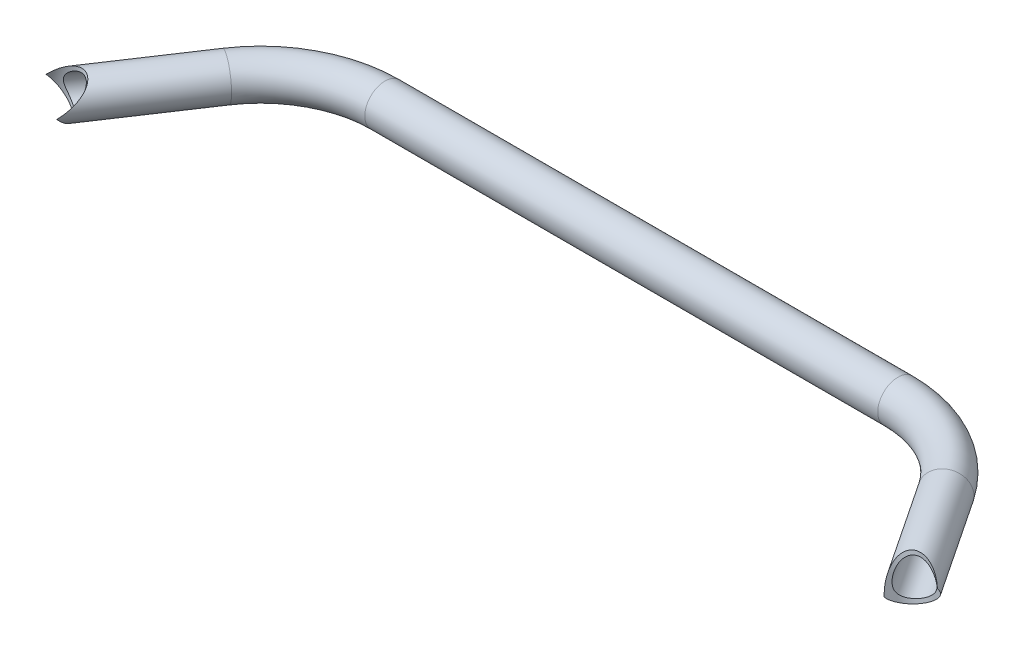
ISO-10303-21;
HEADER;
FILE_DESCRIPTION(('STEP AP214'),'2;1');
FILE_NAME('part.step','',(''),(''),'','','');
FILE_SCHEMA(('AUTOMOTIVE_DESIGN { 1 0 10303 214 1 1 1 1 }'));
ENDSEC;
DATA;
#1=APPLICATION_CONTEXT('core data for automotive mechanical design processes');
#2=APPLICATION_PROTOCOL_DEFINITION('international standard','automotive_design',2000,#1);
#3=PRODUCT_CONTEXT('',#1,'mechanical');
#4=PRODUCT('Part','Part','',(#3));
#5=PRODUCT_RELATED_PRODUCT_CATEGORY('part','',(#4));
#6=PRODUCT_DEFINITION_FORMATION('','',#4);
#7=PRODUCT_DEFINITION_CONTEXT('part definition',#1,'design');
#8=PRODUCT_DEFINITION('design','',#6,#7);
#9=PRODUCT_DEFINITION_SHAPE('','',#8);
#10=(LENGTH_UNIT() NAMED_UNIT(*) SI_UNIT(.MILLI.,.METRE.));
#11=(NAMED_UNIT(*) PLANE_ANGLE_UNIT() SI_UNIT($,.RADIAN.));
#12=(NAMED_UNIT(*) SI_UNIT($,.STERADIAN.) SOLID_ANGLE_UNIT());
#13=UNCERTAINTY_MEASURE_WITH_UNIT(LENGTH_MEASURE(1.E-05),#10,'distance_accuracy_value','');
#14=(GEOMETRIC_REPRESENTATION_CONTEXT(3) GLOBAL_UNCERTAINTY_ASSIGNED_CONTEXT((#13)) GLOBAL_UNIT_ASSIGNED_CONTEXT((#10,
#11,#12)) REPRESENTATION_CONTEXT('',''));
#15=CARTESIAN_POINT('',(0.,0.,0.));
#16=DIRECTION('',(0.,0.,1.));
#17=DIRECTION('',(1.,0.,0.));
#18=AXIS2_PLACEMENT_3D('',#15,#16,#17);
#19=CARTESIAN_POINT('',(-270.262878506434,594.406898796156,-139.7));
#20=DIRECTION('',(0.553808247981639,0.,-0.83264423643445));
#21=DIRECTION('',(-0.83264423643445,0.,-0.553808247981639));
#22=AXIS2_PLACEMENT_3D('',#19,#20,#21);
#23=CYLINDRICAL_SURFACE('',#22,10.287);
#24=CARTESIAN_POINT('',(-274.611975365629,594.406898796156,-151.736204933368));
#25=CARTESIAN_POINT('',(-274.582076108729,594.115933380823,-151.781157630946));
#26=CARTESIAN_POINT('',(-274.535729778486,593.82705969936,-151.828529056111));
#27=CARTESIAN_POINT('',(-274.41452140445,593.255256383878,-151.923589996282));
#28=CARTESIAN_POINT('',(-274.339629723799,592.972333251172,-151.9712797911));
#29=CARTESIAN_POINT('',(-274.164848563277,592.412567177773,-152.063273333682));
#30=CARTESIAN_POINT('',(-274.064861628077,592.135752628127,-152.10756298059));
#31=CARTESIAN_POINT('',(-273.843200535535,591.590058651063,-152.189334420521));
#32=CARTESIAN_POINT('',(-273.721533062038,591.32117680778,-152.226818304508));
#33=CARTESIAN_POINT('',(-273.460175463079,590.794281765628,-152.292029911035));
#34=CARTESIAN_POINT('',(-273.320664220982,590.536190527532,-152.319845458556));
#35=CARTESIAN_POINT('',(-273.024667286098,590.028903894582,-152.363993356945));
#36=CARTESIAN_POINT('',(-272.868181191144,589.779708710677,-152.380325435679));
#37=CARTESIAN_POINT('',(-272.540050506388,589.291371931625,-152.399557911396));
#38=CARTESIAN_POINT('',(-272.368423794064,589.052218958937,-152.40247393882));
#39=CARTESIAN_POINT('',(-272.011337938838,588.584782701938,-152.393207319613));
#40=CARTESIAN_POINT('',(-271.825879496993,588.356498867686,-152.38102543773));
#41=CARTESIAN_POINT('',(-271.423758280319,587.890343442846,-152.338040706149));
#42=CARTESIAN_POINT('',(-271.205818408015,587.653723214399,-152.305530678008));
#43=CARTESIAN_POINT('',(-270.756964801776,587.19727572493,-152.218782367154));
#44=CARTESIAN_POINT('',(-270.526049917994,586.977449956321,-152.164542156091));
#45=CARTESIAN_POINT('',(-270.053645059308,586.557109766013,-152.033080823247));
#46=CARTESIAN_POINT('',(-269.812161717912,586.356583476485,-151.955873945416));
#47=CARTESIAN_POINT('',(-269.321061796585,585.977233780353,-151.77769138738));
#48=CARTESIAN_POINT('',(-269.071447007386,585.798405635762,-151.676720910381));
#49=CARTESIAN_POINT('',(-268.601180660189,585.487546838889,-151.466216169023));
#50=CARTESIAN_POINT('',(-268.381192749715,585.352458681601,-151.359700945455));
#51=CARTESIAN_POINT('',(-267.939269290062,585.101797779158,-151.129176593434));
#52=CARTESIAN_POINT('',(-267.717333924666,584.986223212891,-151.005169099436));
#53=CARTESIAN_POINT('',(-267.273728988713,584.775898904107,-150.740522418265));
#54=CARTESIAN_POINT('',(-267.052059338725,584.681136194432,-150.599893671731));
#55=CARTESIAN_POINT('',(-266.610910838236,584.51327896601,-150.303138175918));
#56=CARTESIAN_POINT('',(-266.391431844381,584.440183020318,-150.147012448151));
#57=CARTESIAN_POINT('',(-265.980536039157,584.323037617388,-149.838775947939));
#58=CARTESIAN_POINT('',(-265.788686855544,584.276678295437,-149.688110809208));
#59=CARTESIAN_POINT('',(-265.409486143942,584.201703427835,-149.377022353868));
#60=CARTESIAN_POINT('',(-265.222134637329,584.173087966496,-149.216598990895));
#61=CARTESIAN_POINT('',(-264.853011818409,584.13352786896,-148.887413649381));
#62=CARTESIAN_POINT('',(-264.671240217261,584.122582316566,-148.718652103649));
#63=CARTESIAN_POINT('',(-264.314121722321,584.11808735521,-148.374246224068));
#64=CARTESIAN_POINT('',(-264.138775144053,584.124538799437,-148.198601553072));
#65=CARTESIAN_POINT('',(-263.79000669249,584.154870919684,-147.83656752283));
#66=CARTESIAN_POINT('',(-263.616800822616,584.17926928272,-147.65001389592));
#67=CARTESIAN_POINT('',(-263.278397174178,584.245513870208,-147.272811000581));
#68=CARTESIAN_POINT('',(-263.113199478211,584.287360274574,-147.08216168994));
#69=CARTESIAN_POINT('',(-262.79102854104,584.387892203045,-146.698288782445));
#70=CARTESIAN_POINT('',(-262.634057781012,584.446582773043,-146.505064430767));
#71=CARTESIAN_POINT('',(-262.328445844146,584.580172961135,-146.117625425795));
#72=CARTESIAN_POINT('',(-262.179805577921,584.655074346914,-145.923410666759));
#73=CARTESIAN_POINT('',(-261.871526607006,584.83149752742,-145.509721181256));
#74=CARTESIAN_POINT('',(-261.7130531326,584.93523460652,-145.290321164587));
#75=CARTESIAN_POINT('',(-261.406235243498,585.162023742278,-144.854418380354));
#76=CARTESIAN_POINT('',(-261.257892172906,585.285078354873,-144.637916000301));
#77=CARTESIAN_POINT('',(-260.970549790214,585.550046218087,-144.209965488957));
#78=CARTESIAN_POINT('',(-260.831559038787,585.691976402175,-143.998522099495));
#79=CARTESIAN_POINT('',(-260.562170633412,585.994231633129,-143.583483479216));
#80=CARTESIAN_POINT('',(-260.431771814367,586.154554177811,-143.379887185866));
#81=CARTESIAN_POINT('',(-260.194834248731,586.471458283465,-143.009232176519));
#82=CARTESIAN_POINT('',(-260.087393958123,586.625829887968,-142.840858678921));
#83=CARTESIAN_POINT('',(-259.877217557075,586.948396484922,-142.514665430573));
#84=CARTESIAN_POINT('',(-259.774481754267,587.116592379358,-142.356846369681));
#85=CARTESIAN_POINT('',(-259.572877853876,587.466470015348,-142.054905185034));
#86=CARTESIAN_POINT('',(-259.474003462614,587.648128282995,-141.910760174657));
#87=CARTESIAN_POINT('',(-259.278870717423,588.02495883924,-141.639342190141));
#88=CARTESIAN_POINT('',(-259.182611355638,588.220125815546,-141.512062640413));
#89=CARTESIAN_POINT('',(-259.017487292259,588.568781435159,-141.309954046311));
#90=CARTESIAN_POINT('',(-258.948252212227,588.719272570624,-141.230247928182));
#91=CARTESIAN_POINT('',(-258.810297223909,589.026550515003,-141.083581152011));
#92=CARTESIAN_POINT('',(-258.741577165877,589.18333540243,-141.016616639248));
#93=CARTESIAN_POINT('',(-258.604545552731,589.502144440168,-140.897077132109));
#94=CARTESIAN_POINT('',(-258.53623350067,589.664159194454,-140.844477780359));
#95=CARTESIAN_POINT('',(-258.399860653449,589.992549872062,-140.754794497396));
#96=CARTESIAN_POINT('',(-258.33179985446,590.158925728646,-140.717710328897));
#97=CARTESIAN_POINT('',(-258.195822224413,590.495296350005,-140.659724288));
#98=CARTESIAN_POINT('',(-258.127906931458,590.665302493397,-140.638884648432));
#99=CARTESIAN_POINT('',(-257.992814062861,591.006811338237,-140.613747037851));
#100=CARTESIAN_POINT('',(-257.925636483974,591.178314033095,-140.609448994043));
#101=CARTESIAN_POINT('',(-257.79240098636,591.52158920729,-140.616848057836));
#102=CARTESIAN_POINT('',(-257.726344286728,591.693361782915,-140.628561575972));
#103=CARTESIAN_POINT('',(-257.595889242748,592.035941974095,-140.666925799881));
#104=CARTESIAN_POINT('',(-257.531491936133,592.206748936056,-140.693585626339));
#105=CARTESIAN_POINT('',(-257.381898752813,592.608162317545,-140.772574343849));
#106=CARTESIAN_POINT('',(-257.297635408227,592.837976684038,-140.83070739835));
#107=CARTESIAN_POINT('',(-257.134299884718,593.292930698897,-140.968222900946));
#108=CARTESIAN_POINT('',(-257.055228247841,593.51806985747,-141.047607563459));
#109=CARTESIAN_POINT('',(-256.902938761752,593.964118911411,-141.22430468573));
#110=CARTESIAN_POINT('',(-256.829741174738,594.185012323472,-141.321675670897));
#111=CARTESIAN_POINT('',(-256.690281220004,594.62189942529,-141.531090588348));
#112=CARTESIAN_POINT('',(-256.624018762139,594.837893178708,-141.643134329866));
#113=CARTESIAN_POINT('',(-256.461041709912,595.395626853542,-141.951391911024));
#114=CARTESIAN_POINT('',(-256.370371199602,595.733800091885,-142.157295926447));
#115=CARTESIAN_POINT('',(-256.211427648958,596.400006325126,-142.592960509066));
#116=CARTESIAN_POINT('',(-256.143168500043,596.728032917091,-142.82273575686));
#117=CARTESIAN_POINT('',(-256.031882409486,597.374779618118,-143.300714080033));
#118=CARTESIAN_POINT('',(-255.988854136236,597.693500217479,-143.548916182121));
#119=CARTESIAN_POINT('',(-255.93113717954,598.321770158966,-144.059613845064));
#120=CARTESIAN_POINT('',(-255.916435885819,598.631323521597,-144.322102992243));
#121=CARTESIAN_POINT('',(-255.918607689646,599.174576381071,-144.799860055523));
#122=CARTESIAN_POINT('',(-255.929323085845,599.410163489604,-145.013019053361));
#123=CARTESIAN_POINT('',(-255.972188229145,599.874671955724,-145.444482894816));
#124=CARTESIAN_POINT('',(-256.004338593134,600.103593121271,-145.662787886356));
#125=CARTESIAN_POINT('',(-256.09204532553,600.553102218587,-146.102326197866));
#126=CARTESIAN_POINT('',(-256.147551164855,600.773707026584,-146.32355220336));
#127=CARTESIAN_POINT('',(-256.284137354081,601.20550727123,-146.767468922239));
#128=CARTESIAN_POINT('',(-256.365219236206,601.416702143279,-146.990159722595));
#129=CARTESIAN_POINT('',(-256.530739325767,601.774858058883,-147.377674852376));
#130=CARTESIAN_POINT('',(-256.609012960576,601.924430336974,-147.542729277797));
#131=CARTESIAN_POINT('',(-256.781625817116,602.215990888271,-147.871101643019));
#132=CARTESIAN_POINT('',(-256.875960858978,602.357981122053,-148.034420022895));
#133=CARTESIAN_POINT('',(-257.081275689819,602.633105087115,-148.357966988319));
#134=CARTESIAN_POINT('',(-257.192250458152,602.766241472405,-148.518196489462));
#135=CARTESIAN_POINT('',(-257.431197838064,603.022320264297,-148.834118244295));
#136=CARTESIAN_POINT('',(-257.55917065215,603.145262549423,-148.989810443903));
#137=CARTESIAN_POINT('',(-257.833312324253,603.380568936413,-149.29641510338));
#138=CARTESIAN_POINT('',(-257.979636222049,603.492826552981,-149.447271149215));
#139=CARTESIAN_POINT('',(-258.289018233597,603.704031178803,-149.740969444043));
#140=CARTESIAN_POINT('',(-258.452076282448,603.802978239678,-149.883811724114));
#141=CARTESIAN_POINT('',(-258.793744395931,603.986213531596,-150.159722520711));
#142=CARTESIAN_POINT('',(-258.972344053195,604.070511460709,-150.292797469471));
#143=CARTESIAN_POINT('',(-259.343603119581,604.223527218801,-150.547803738469));
#144=CARTESIAN_POINT('',(-259.536260961026,604.292246781478,-150.669736297829));
#145=CARTESIAN_POINT('',(-259.90686462927,604.405338682094,-150.885723246821));
#146=CARTESIAN_POINT('',(-260.083299088081,604.451743340734,-150.981320807589));
#147=CARTESIAN_POINT('',(-260.443836172604,604.53232604734,-151.162878285257));
#148=CARTESIAN_POINT('',(-260.627941589939,604.56649959999,-151.248834650761));
#149=CARTESIAN_POINT('',(-261.002266095418,604.622680630135,-151.41081068781));
#150=CARTESIAN_POINT('',(-261.192485318392,604.64468783913,-151.486830140028));
#151=CARTESIAN_POINT('',(-261.577597995387,604.676824757415,-151.628918426293));
#152=CARTESIAN_POINT('',(-261.772492390269,604.686952055101,-151.694985237598));
#153=CARTESIAN_POINT('',(-262.217553366296,604.696908836119,-151.833497178495));
#154=CARTESIAN_POINT('',(-262.468716286433,604.693309874317,-151.903014318819));
#155=CARTESIAN_POINT('',(-262.973818301604,604.66888861983,-152.027079298025));
#156=CARTESIAN_POINT('',(-263.227758010626,604.648062438741,-152.081623753678));
#157=CARTESIAN_POINT('',(-263.991281712282,604.561437727661,-152.224317749179));
#158=CARTESIAN_POINT('',(-264.502302677001,604.471489534751,-152.291447859001));
#159=CARTESIAN_POINT('',(-265.357559280804,604.273050151264,-152.365083426165));
#160=CARTESIAN_POINT('',(-265.704415243869,604.178938436015,-152.383928026837));
#161=CARTESIAN_POINT('',(-266.39148151337,603.966871048511,-152.402402484021));
#162=CARTESIAN_POINT('',(-266.731689057246,603.84890568625,-152.402024516116));
#163=CARTESIAN_POINT('',(-267.403948892215,603.590726407942,-152.385031587123));
#164=CARTESIAN_POINT('',(-267.735980263743,603.450461135349,-152.368378677793));
#165=CARTESIAN_POINT('',(-268.389396456275,603.149104222519,-152.321786069872));
#166=CARTESIAN_POINT('',(-268.710782863501,602.988015702883,-152.291848360528));
#167=CARTESIAN_POINT('',(-269.352209992212,602.639632146513,-152.220489280254));
#168=CARTESIAN_POINT('',(-269.671824333149,602.4516263776,-152.17870838961));
#169=CARTESIAN_POINT('',(-270.296097880479,602.053584432275,-152.087672035072));
#170=CARTESIAN_POINT('',(-270.600751897807,601.843540690016,-152.038414001593));
#171=CARTESIAN_POINT('',(-271.191514295365,601.400958996423,-151.936586059321));
#172=CARTESIAN_POINT('',(-271.477667105941,601.168478552365,-151.884024731878));
#173=CARTESIAN_POINT('',(-272.028146496136,600.678778275252,-151.780319833048));
#174=CARTESIAN_POINT('',(-272.292491249721,600.421579436584,-151.729175105226));
#175=CARTESIAN_POINT('',(-272.678295987201,600.004411558751,-151.656105137929));
#176=CARTESIAN_POINT('',(-272.809642938843,599.854007525459,-151.63154421525));
#177=CARTESIAN_POINT('',(-273.062884524206,599.544873666561,-151.585712290947));
#178=CARTESIAN_POINT('',(-273.184777905875,599.386142742775,-151.564441724734));
#179=CARTESIAN_POINT('',(-273.417328140583,599.060455125178,-151.526401569833));
#180=CARTESIAN_POINT('',(-273.528001434113,598.893511015111,-151.509625334693));
#181=CARTESIAN_POINT('',(-273.736461442334,598.551380736019,-151.481707144114));
#182=CARTESIAN_POINT('',(-273.834254879273,598.376198931718,-151.470562240888));
#183=CARTESIAN_POINT('',(-274.016397432141,598.015562356852,-151.454797993114));
#184=CARTESIAN_POINT('',(-274.100539720539,597.829998286555,-151.450271953932));
#185=CARTESIAN_POINT('',(-274.251895494595,597.452032488914,-151.448733875008));
#186=CARTESIAN_POINT('',(-274.319109528682,597.259630983314,-151.451721591807));
#187=CARTESIAN_POINT('',(-274.435270060266,596.869782434538,-151.465334553514));
#188=CARTESIAN_POINT('',(-274.484228948887,596.672338911375,-151.475954603403));
#189=CARTESIAN_POINT('',(-274.563405589457,596.274301285369,-151.504295935993));
#190=CARTESIAN_POINT('',(-274.593627102421,596.073707823082,-151.522015792425));
#191=CARTESIAN_POINT('',(-274.640108603166,595.628220752844,-151.56790656973));
#192=CARTESIAN_POINT('',(-274.652007900813,595.383016168041,-151.597501333023));
#193=CARTESIAN_POINT('',(-274.650407745834,594.893689096076,-151.662905450747));
#194=CARTESIAN_POINT('',(-274.636911604778,594.649566471989,-151.698713994347));
#195=CARTESIAN_POINT('',(-274.611975365629,594.406898796156,-151.736204933368));
#196=B_SPLINE_CURVE_WITH_KNOTS('',3,(#24,#25,#26,#27,#28,#29,#30,#31,#32,#33,#34,#35,#36,#37,
#38,#39,#40,#41,#42,#43,#44,#45,#46,#47,#48,#49,#50,#51,#52,#53,#54,#55,#56,#57,#58,#59,#60,#61,
#62,#63,#64,#65,#66,#67,#68,#69,#70,#71,#72,#73,#74,#75,#76,#77,#78,#79,#80,#81,#82,#83,#84,#85,
#86,#87,#88,#89,#90,#91,#92,#93,#94,#95,#96,#97,#98,#99,#100,#101,#102,#103,#104,#105,#106,#107,
#108,#109,#110,#111,#112,#113,#114,#115,#116,#117,#118,#119,#120,#121,#122,#123,#124,#125,#126,
#127,#128,#129,#130,#131,#132,#133,#134,#135,#136,#137,#138,#139,#140,#141,#142,#143,#144,#145,
#146,#147,#148,#149,#150,#151,#152,#153,#154,#155,#156,#157,#158,#159,#160,#161,#162,#163,#164,
#165,#166,#167,#168,#169,#170,#171,#172,#173,#174,#175,#176,#177,#178,#179,#180,#181,#182,#183,
#184,#185,#186,#187,#188,#189,#190,#191,#192,#193,#194,#195),.UNSPECIFIED.,.T.,.F.,(4,2,2,2,2,2,
2,2,2,2,2,2,2,2,2,2,2,2,2,2,2,2,2,2,2,2,2,2,2,2,2,2,2,2,2,2,2,2,2,2,2,2,2,2,2,2,2,2,2,2,2,2,2,2,
2,2,2,2,2,2,2,2,2,2,2,2,2,2,2,2,2,2,2,2,2,2,2,2,2,2,2,2,2,2,2,4),(0.,0.887423883337758,
1.77577164442881,2.66762410314902,3.55920208880639,4.44245545707858,5.32572975584576,
6.20797473021,7.09017501849149,8.05879389419339,9.02749874480351,9.99560405189722,
10.9634975825277,11.8001121543026,12.6366486056134,13.4726623516033,14.308621026672,
15.0526750421743,15.796732593113,16.5407515628895,17.2848070217543,18.0512110549819,
18.8176229910729,19.5842647560439,20.350990160481,21.2196557809287,22.0884364331144,
22.9580018021537,23.827449011404,24.5841702361956,25.3409408734744,26.0964216696178,
26.8516070430467,27.4026202194882,27.9534664317674,28.5033727544261,29.0532706666372,
29.6052650246151,30.1572569533421,30.7098150527805,31.2627107073368,32.0162402397385,
32.769848320524,33.5259531889715,34.2820482279956,35.4988149249905,36.7163344029179,
37.9337896180972,39.1507027354166,40.1036264798242,41.0565776501254,42.0074776458317,
42.9584346194231,43.6661253057949,44.3736321013774,45.0809258514302,45.7882280286051,
46.5019690274583,47.2157072582388,47.9289711622977,48.6421556490218,49.2593226209853,
49.8767161889105,50.4941233816434,51.1116558854698,51.8923744357708,52.6732692523884,
54.2358864732946,55.3143631555046,56.3932788278954,57.47471622215,58.5559917381358,
59.674452673182,60.79329885087,61.9093498624937,63.024461203513,63.6276836478692,
64.2309858483774,64.8333908662866,65.4354802206961,66.045977968496,66.6564559353363,
67.2665187677895,67.8764591071538,68.6166748275501,69.3567940303821),.UNSPECIFIED.);
#197=CARTESIAN_POINT('',(-274.611975365629,594.406898796156,-151.736204933368));
#198=VERTEX_POINT('',#197);
#199=EDGE_CURVE('E49',#198,#198,#196,.T.);
#200=ORIENTED_EDGE('',*,*,#199,.T.);
#201=EDGE_LOOP('',(#200));
#202=FACE_BOUND('',#201,.T.);
#203=CARTESIAN_POINT('',(-226.416989788848,594.406898796156,-205.621781889487));
#204=DIRECTION('',(-0.553808247981638,0.,0.83264423643445));
#205=DIRECTION('',(0.83264423643445,0.,0.553808247981638));
#206=AXIS2_PLACEMENT_3D('',#203,#204,#205);
#207=CIRCLE('',#206,10.287);
#208=CARTESIAN_POINT('',(-234.982401049049,594.406898796156,-211.318807336474));
#209=VERTEX_POINT('',#208);
#210=EDGE_CURVE('E112',#209,#209,#207,.F.);
#211=ORIENTED_EDGE('',*,*,#210,.T.);
#212=EDGE_LOOP('',(#211));
#213=FACE_BOUND('',#212,.T.);
#214=ADVANCED_FACE('F45',(#202,#213),#23,.F.);
#215=CARTESIAN_POINT('',(-270.262878506434,594.406898796156,-139.7));
#216=DIRECTION('',(0.553808247981639,0.,-0.83264423643445));
#217=DIRECTION('',(-0.83264423643445,0.,-0.553808247981639));
#218=AXIS2_PLACEMENT_3D('',#215,#216,#217);
#219=CYLINDRICAL_SURFACE('',#218,12.7);
#220=CARTESIAN_POINT('',(-270.262878506435,594.406898796156,-139.7));
#221=DIRECTION('',(0.150809635886844,-0.737110127393131,-0.65872992479328));
#222=DIRECTION('',(0.591635718191291,0.601137495126815,-0.537215868076264));
#223=AXIS2_PLACEMENT_3D('',#220,#221,#222);
#224=ELLIPSE('',#223,20.0947047461687,12.7);
#225=CARTESIAN_POINT('',(-260.20480217977,590.486271347968,-133.010173319173));
#226=VERTEX_POINT('',#225);
#227=CARTESIAN_POINT('',(-280.320954833099,598.327526244344,-146.389826680827));
#228=VERTEX_POINT('',#227);
#229=EDGE_CURVE('E68',#226,#228,#224,.F.);
#230=ORIENTED_EDGE('',*,*,#229,.F.);
#231=CARTESIAN_POINT('',(-270.262878506435,594.406898796156,-139.7));
#232=DIRECTION('',(0.591635718191291,0.601137495126815,-0.537215868076264));
#233=DIRECTION('',(0.150809635886844,-0.737110127393131,-0.65872992479328));
#234=AXIS2_PLACEMENT_3D('',#231,#232,#233);
#235=ELLIPSE('',#234,16.3878910728656,12.7);
#236=EDGE_CURVE('E59',#228,#226,#235,.F.);
#237=ORIENTED_EDGE('',*,*,#236,.F.);
#238=EDGE_LOOP('',(#230,#237));
#239=FACE_BOUND('',#238,.T.);
#240=CARTESIAN_POINT('',(-226.416989788848,594.406898796156,-205.621781889487));
#241=DIRECTION('',(0.553808247981639,0.,-0.83264423643445));
#242=DIRECTION('',(-0.83264423643445,0.,-0.553808247981639));
#243=AXIS2_PLACEMENT_3D('',#240,#241,#242);
#244=CIRCLE('',#243,12.7);
#245=CARTESIAN_POINT('',(-236.991571591565,594.406898796156,-212.655146638854));
#246=VERTEX_POINT('',#245);
#247=EDGE_CURVE('E11',#246,#246,#244,.T.);
#248=ORIENTED_EDGE('',*,*,#247,.F.);
#249=EDGE_LOOP('',(#248));
#250=FACE_BOUND('',#249,.T.);
#251=ADVANCED_FACE('F47',(#239,#250),#219,.T.);
#252=CARTESIAN_POINT('',(-76.9133172812,1090.43072922398,-139.7));
#253=DIRECTION('',(-0.363182667764731,-0.931717956162321,0.));
#254=DIRECTION('',(0.931717956162321,-0.363182667764731,0.));
#255=AXIS2_PLACEMENT_3D('',#252,#253,#254);
#256=CYLINDRICAL_SURFACE('',#255,12.7);
#257=ORIENTED_EDGE('',*,*,#199,.F.);
#258=EDGE_LOOP('',(#257));
#259=FACE_BOUND('',#258,.T.);
#260=ORIENTED_EDGE('',*,*,#229,.T.);
#261=ORIENTED_EDGE('',*,*,#236,.T.);
#262=EDGE_LOOP('',(#260,#261));
#263=FACE_BOUND('',#262,.T.);
#264=ADVANCED_FACE('F150',(#259,#263),#256,.F.);
#265=CARTESIAN_POINT('',(-161.277565884108,594.406898796156,-162.296255033388));
#266=DIRECTION('',(0.,-1.,0.));
#267=DIRECTION('',(0.,0.,-1.));
#268=AXIS2_PLACEMENT_3D('',#265,#266,#267);
#269=TOROIDAL_SURFACE('',#268,78.232,10.287);
#270=CARTESIAN_POINT('',(-161.277565884108,594.406898796156,-240.528255033388));
#271=DIRECTION('',(1.,0.,0.));
#272=DIRECTION('',(0.,0.,-1.));
#273=AXIS2_PLACEMENT_3D('',#270,#271,#272);
#274=CIRCLE('',#273,10.287);
#275=CARTESIAN_POINT('',(-161.277565884108,594.406898796156,-250.815255033388));
#276=VERTEX_POINT('',#275);
#277=EDGE_CURVE('E117',#276,#276,#274,.F.);
#278=CARTESIAN_POINT('',(-161.277565884108,594.406898796156,-162.296255033388));
#279=DIRECTION('',(0.,-1.,0.));
#280=DIRECTION('',(0.,0.,-1.));
#281=AXIS2_PLACEMENT_3D('',#278,#279,#280);
#282=CIRCLE('',#281,88.519);
#283=EDGE_CURVE('',#209,#276,#282,.T.);
#284=ORIENTED_EDGE('',*,*,#210,.F.);
#285=ORIENTED_EDGE('',*,*,#277,.F.);
#286=ORIENTED_EDGE('',*,*,#283,.T.);
#287=ORIENTED_EDGE('',*,*,#283,.F.);
#288=EDGE_LOOP('',(#284,#286,#285,#287));
#289=FACE_BOUND('',#288,.T.);
#290=ADVANCED_FACE('F157',(#289),#269,.F.);
#291=CARTESIAN_POINT('',(-161.277565884108,594.406898796156,-162.296255033388));
#292=DIRECTION('',(0.,-1.,0.));
#293=DIRECTION('',(0.,0.,-1.));
#294=AXIS2_PLACEMENT_3D('',#291,#292,#293);
#295=TOROIDAL_SURFACE('',#294,78.232,12.7);
#296=CARTESIAN_POINT('',(-161.277565884108,594.406898796156,-240.528255033388));
#297=DIRECTION('',(1.,0.,0.));
#298=DIRECTION('',(0.,0.,-1.));
#299=AXIS2_PLACEMENT_3D('',#296,#297,#298);
#300=CIRCLE('',#299,12.7);
#301=CARTESIAN_POINT('',(-161.277565884108,594.406898796156,-253.228255033388));
#302=VERTEX_POINT('',#301);
#303=EDGE_CURVE('E113',#302,#302,#300,.T.);
#304=CARTESIAN_POINT('',(-161.277565884108,594.406898796156,-162.296255033388));
#305=DIRECTION('',(0.,-1.,0.));
#306=DIRECTION('',(0.,0.,-1.));
#307=AXIS2_PLACEMENT_3D('',#304,#305,#306);
#308=CIRCLE('',#307,90.932);
#309=EDGE_CURVE('',#246,#302,#308,.T.);
#310=ORIENTED_EDGE('',*,*,#247,.T.);
#311=ORIENTED_EDGE('',*,*,#303,.F.);
#312=ORIENTED_EDGE('',*,*,#309,.T.);
#313=ORIENTED_EDGE('',*,*,#309,.F.);
#314=EDGE_LOOP('',(#310,#312,#311,#313));
#315=FACE_BOUND('',#314,.T.);
#316=ADVANCED_FACE('F159',(#315),#295,.T.);
#317=CARTESIAN_POINT('',(-161.277565884108,594.406898796156,-240.528255033388));
#318=DIRECTION('',(1.,0.,0.));
#319=DIRECTION('',(0.,0.,-1.));
#320=AXIS2_PLACEMENT_3D('',#317,#318,#319);
#321=CYLINDRICAL_SURFACE('',#320,10.287);
#322=ORIENTED_EDGE('',*,*,#277,.T.);
#323=EDGE_LOOP('',(#322));
#324=FACE_BOUND('',#323,.T.);
#325=CARTESIAN_POINT('',(161.277565884108,594.406898796156,-240.528255033388));
#326=DIRECTION('',(-1.,0.,0.));
#327=DIRECTION('',(0.,-1.,0.));
#328=AXIS2_PLACEMENT_3D('',#325,#326,#327);
#329=CIRCLE('',#328,10.287);
#330=CARTESIAN_POINT('',(161.277565884108,594.406898796156,-250.815255033388));
#331=VERTEX_POINT('',#330);
#332=EDGE_CURVE('E87',#331,#331,#329,.F.);
#333=ORIENTED_EDGE('',*,*,#332,.T.);
#334=EDGE_LOOP('',(#333));
#335=FACE_BOUND('',#334,.T.);
#336=ADVANCED_FACE('F162',(#324,#335),#321,.F.);
#337=CARTESIAN_POINT('',(-161.277565884108,594.406898796156,-240.528255033388));
#338=DIRECTION('',(1.,0.,0.));
#339=DIRECTION('',(0.,0.,-1.));
#340=AXIS2_PLACEMENT_3D('',#337,#338,#339);
#341=CYLINDRICAL_SURFACE('',#340,12.7);
#342=ORIENTED_EDGE('',*,*,#303,.T.);
#343=EDGE_LOOP('',(#342));
#344=FACE_BOUND('',#343,.T.);
#345=CARTESIAN_POINT('',(161.277565884108,594.406898796156,-240.528255033388));
#346=DIRECTION('',(1.,0.,0.));
#347=DIRECTION('',(0.,0.,-1.));
#348=AXIS2_PLACEMENT_3D('',#345,#346,#347);
#349=CIRCLE('',#348,12.7);
#350=CARTESIAN_POINT('',(161.277565884108,594.406898796156,-253.228255033388));
#351=VERTEX_POINT('',#350);
#352=EDGE_CURVE('E108',#351,#351,#349,.T.);
#353=ORIENTED_EDGE('',*,*,#352,.F.);
#354=EDGE_LOOP('',(#353));
#355=FACE_BOUND('',#354,.T.);
#356=ADVANCED_FACE('F167',(#344,#355),#341,.T.);
#357=CARTESIAN_POINT('',(161.277565884108,594.406898796156,-162.296255033388));
#358=DIRECTION('',(0.,-1.,0.));
#359=DIRECTION('',(0.,0.,-1.));
#360=AXIS2_PLACEMENT_3D('',#357,#358,#359);
#361=TOROIDAL_SURFACE('',#360,78.232,10.287);
#362=CARTESIAN_POINT('',(226.416989788848,594.406898796156,-205.621781889487));
#363=DIRECTION('',(0.553808247981637,0.,0.832644236434451));
#364=DIRECTION('',(0.832644236434451,0.,-0.553808247981637));
#365=AXIS2_PLACEMENT_3D('',#362,#363,#364);
#366=CIRCLE('',#365,10.287);
#367=CARTESIAN_POINT('',(234.982401049049,594.406898796156,-211.318807336474));
#368=VERTEX_POINT('',#367);
#369=EDGE_CURVE('E103',#368,#368,#366,.F.);
#370=CARTESIAN_POINT('',(161.277565884108,594.406898796156,-162.296255033388));
#371=DIRECTION('',(0.,-1.,0.));
#372=DIRECTION('',(0.,0.,-1.));
#373=AXIS2_PLACEMENT_3D('',#370,#371,#372);
#374=CIRCLE('',#373,88.519);
#375=EDGE_CURVE('',#331,#368,#374,.T.);
#376=ORIENTED_EDGE('',*,*,#332,.F.);
#377=ORIENTED_EDGE('',*,*,#369,.F.);
#378=ORIENTED_EDGE('',*,*,#375,.T.);
#379=ORIENTED_EDGE('',*,*,#375,.F.);
#380=EDGE_LOOP('',(#376,#378,#377,#379));
#381=FACE_BOUND('',#380,.T.);
#382=ADVANCED_FACE('F170',(#381),#361,.F.);
#383=CARTESIAN_POINT('',(161.277565884108,594.406898796156,-162.296255033388));
#384=DIRECTION('',(0.,-1.,0.));
#385=DIRECTION('',(0.,0.,-1.));
#386=AXIS2_PLACEMENT_3D('',#383,#384,#385);
#387=TOROIDAL_SURFACE('',#386,78.232,12.7);
#388=CARTESIAN_POINT('',(226.416989788848,594.406898796156,-205.621781889487));
#389=DIRECTION('',(0.553808247981637,0.,0.832644236434451));
#390=DIRECTION('',(0.832644236434451,0.,-0.553808247981637));
#391=AXIS2_PLACEMENT_3D('',#388,#389,#390);
#392=CIRCLE('',#391,12.7);
#393=CARTESIAN_POINT('',(236.991571591565,594.406898796156,-212.655146638854));
#394=VERTEX_POINT('',#393);
#395=EDGE_CURVE('E92',#394,#394,#392,.T.);
#396=CARTESIAN_POINT('',(161.277565884108,594.406898796156,-162.296255033388));
#397=DIRECTION('',(0.,-1.,0.));
#398=DIRECTION('',(0.,0.,-1.));
#399=AXIS2_PLACEMENT_3D('',#396,#397,#398);
#400=CIRCLE('',#399,90.932);
#401=EDGE_CURVE('',#351,#394,#400,.T.);
#402=ORIENTED_EDGE('',*,*,#352,.T.);
#403=ORIENTED_EDGE('',*,*,#395,.F.);
#404=ORIENTED_EDGE('',*,*,#401,.T.);
#405=ORIENTED_EDGE('',*,*,#401,.F.);
#406=EDGE_LOOP('',(#402,#404,#403,#405));
#407=FACE_BOUND('',#406,.T.);
#408=ADVANCED_FACE('F175',(#407),#387,.T.);
#409=CARTESIAN_POINT('',(226.416989788848,594.406898796156,-205.621781889487));
#410=DIRECTION('',(0.553808247981637,0.,0.832644236434451));
#411=DIRECTION('',(0.832644236434451,0.,-0.553808247981637));
#412=AXIS2_PLACEMENT_3D('',#409,#410,#411);
#413=CYLINDRICAL_SURFACE('',#412,10.287);
#414=CARTESIAN_POINT('',(274.611975365629,594.406898796156,-151.736204933368));
#415=CARTESIAN_POINT('',(274.631537092773,594.597246703728,-151.706798477842));
#416=CARTESIAN_POINT('',(274.644055562792,594.788453974988,-151.678430374484));
#417=CARTESIAN_POINT('',(274.653801105204,595.1717062049,-151.625149823471));
#418=CARTESIAN_POINT('',(274.651035277454,595.363750733209,-151.600235776852));
#419=CARTESIAN_POINT('',(274.629227286598,595.74720611606,-151.555218065277));
#420=CARTESIAN_POINT('',(274.610210292006,595.938617491249,-151.5351070234));
#421=CARTESIAN_POINT('',(274.555350501468,596.319562080426,-151.500779177323));
#422=CARTESIAN_POINT('',(274.519508729488,596.509095407997,-151.486562014517));
#423=CARTESIAN_POINT('',(274.430853480966,596.885321876315,-151.464735985225));
#424=CARTESIAN_POINT('',(274.377974894085,597.072001195524,-151.457152892349));
#425=CARTESIAN_POINT('',(274.255998484467,597.440127681862,-151.448943869082));
#426=CARTESIAN_POINT('',(274.186900346335,597.621574747171,-151.448318073989));
#427=CARTESIAN_POINT('',(274.03365898224,597.978176890035,-151.453755504433));
#428=CARTESIAN_POINT('',(273.949494034547,598.153322438999,-151.459828453638));
#429=CARTESIAN_POINT('',(273.767791386426,598.496232224488,-151.477979402722));
#430=CARTESIAN_POINT('',(273.670248865791,598.663993771498,-151.490059571261));
#431=CARTESIAN_POINT('',(273.428709261149,599.046839848229,-151.524185658539));
#432=CARTESIAN_POINT('',(273.280125129148,599.25885270311,-151.548217183106));
#433=CARTESIAN_POINT('',(272.9658703376,599.668888728113,-151.602752229931));
#434=CARTESIAN_POINT('',(272.80019241122,599.866905887672,-151.633258510582));
#435=CARTESIAN_POINT('',(272.454294413381,600.250114862255,-151.698378851999));
#436=CARTESIAN_POINT('',(272.274031362528,600.435265544599,-151.733005206132));
#437=CARTESIAN_POINT('',(271.901761377455,600.79287084257,-151.804106910902));
#438=CARTESIAN_POINT('',(271.709754638938,600.965325669661,-151.840582230724));
#439=CARTESIAN_POINT('',(271.201167325407,601.395201318739,-151.934690648184));
#440=CARTESIAN_POINT('',(270.877049720537,601.643742459419,-151.992298086469));
#441=CARTESIAN_POINT('',(270.208442781054,602.113464893377,-152.10128270755));
#442=CARTESIAN_POINT('',(269.863941548546,602.334629969726,-152.152656197154));
#443=CARTESIAN_POINT('',(269.157998959446,602.750312024855,-152.244054557592));
#444=CARTESIAN_POINT('',(268.796565772737,602.944841681389,-152.284084837267));
#445=CARTESIAN_POINT('',(268.059226242358,603.306983947666,-152.348229147371));
#446=CARTESIAN_POINT('',(267.683327052214,603.47460965481,-152.372350940273));
#447=CARTESIAN_POINT('',(267.016488724748,603.742501003079,-152.396709200635));
#448=CARTESIAN_POINT('',(266.72823136357,603.849059861478,-152.401457408796));
#449=CARTESIAN_POINT('',(266.146073551126,604.045380328347,-152.397761176948));
#450=CARTESIAN_POINT('',(265.852173085823,604.135141895031,-152.389316704119));
#451=CARTESIAN_POINT('',(265.260713966373,604.296358375234,-152.357337673638));
#452=CARTESIAN_POINT('',(264.963162638319,604.367845143342,-152.333829627514));
#453=CARTESIAN_POINT('',(264.365824943218,604.491044009406,-152.269813501835));
#454=CARTESIAN_POINT('',(264.06603949253,604.542763804097,-152.229312051973));
#455=CARTESIAN_POINT('',(263.538479762116,604.614775688242,-152.141419190706));
#456=CARTESIAN_POINT('',(263.310660084815,604.639628564381,-152.098003121336));
#457=CARTESIAN_POINT('',(262.856564690984,604.675965289565,-151.999546168317));
#458=CARTESIAN_POINT('',(262.630288167415,604.687456761266,-151.944511934007));
#459=CARTESIAN_POINT('',(262.180800516386,604.696259970931,-151.82220206577));
#460=CARTESIAN_POINT('',(261.957588848892,604.693574239947,-151.754928618975));
#461=CARTESIAN_POINT('',(261.516032795786,604.673299654624,-151.607723512726));
#462=CARTESIAN_POINT('',(261.297688458649,604.655710651923,-151.527791727264));
#463=CARTESIAN_POINT('',(260.866091171443,604.604876112827,-151.35440910051));
#464=CARTESIAN_POINT('',(260.652897370957,604.571498596805,-151.260848987799));
#465=CARTESIAN_POINT('',(260.235767240115,604.488781212054,-151.060962329013));
#466=CARTESIAN_POINT('',(260.031830880341,604.439441394053,-150.95463582351));
#467=CARTESIAN_POINT('',(259.63550646061,604.324947192242,-150.729922908341));
#468=CARTESIAN_POINT('',(259.443112103222,604.259801531958,-150.611543171912));
#469=CARTESIAN_POINT('',(259.071728638837,604.1141998824,-150.363714434161));
#470=CARTESIAN_POINT('',(258.892738236232,604.033745375527,-150.234266505274));
#471=CARTESIAN_POINT('',(258.571664932087,603.869630336152,-149.982829077046));
#472=CARTESIAN_POINT('',(258.427787492919,603.787690403455,-149.86199721396));
#473=CARTESIAN_POINT('',(258.15214006306,603.613592531113,-149.613935576726));
#474=CARTESIAN_POINT('',(258.020374528712,603.521430857874,-149.486703474159));
#475=CARTESIAN_POINT('',(257.769487315041,603.327804052368,-149.226976841764));
#476=CARTESIAN_POINT('',(257.650366001513,603.226338651103,-149.094482159843));
#477=CARTESIAN_POINT('',(257.424940216636,603.015039479957,-148.82531077968));
#478=CARTESIAN_POINT('',(257.31863841332,602.905203975802,-148.68863321828));
#479=CARTESIAN_POINT('',(257.090025417713,602.64538260117,-148.372306760159));
#480=CARTESIAN_POINT('',(256.971920687339,602.492943656606,-148.191618757206));
#481=CARTESIAN_POINT('',(256.756340614157,602.177674554749,-147.827122437755));
#482=CARTESIAN_POINT('',(256.658870340132,602.014841857023,-147.643313366527));
#483=CARTESIAN_POINT('',(256.395806704604,601.512864731164,-147.089413057547));
#484=CARTESIAN_POINT('',(256.259696342985,601.160401273519,-146.71704297454));
#485=CARTESIAN_POINT('',(256.088232227872,600.543895897637,-146.092599552589));
#486=CARTESIAN_POINT('',(256.034750489591,600.28610915183,-145.83884419383));
#487=CARTESIAN_POINT('',(255.957556692111,599.760752548862,-145.33670965082));
#488=CARTESIAN_POINT('',(255.933856936219,599.493178695467,-145.088332730083));
#489=CARTESIAN_POINT('',(255.913260533974,598.949142869917,-144.599013599497));
#490=CARTESIAN_POINT('',(255.916435590963,598.672659082277,-144.358093001248));
#491=CARTESIAN_POINT('',(255.947009239895,598.112222279248,-143.886842159411));
#492=CARTESIAN_POINT('',(255.974403925226,597.828270475613,-143.65651021418));
#493=CARTESIAN_POINT('',(256.052305585498,597.243133571716,-143.201456193127));
#494=CARTESIAN_POINT('',(256.103570506346,596.941691167592,-142.977194925245));
#495=CARTESIAN_POINT('',(256.227062005789,596.330266942864,-142.546462992188));
#496=CARTESIAN_POINT('',(256.299297235513,596.020281645827,-142.339999715111));
#497=CARTESIAN_POINT('',(256.462247385251,595.39189642576,-141.95059444498));
#498=CARTESIAN_POINT('',(256.552903350566,595.073526099372,-141.767580376922));
#499=CARTESIAN_POINT('',(256.750588349424,594.42637078267,-141.431397842503));
#500=CARTESIAN_POINT('',(256.857600339954,594.097596912428,-141.278198682395));
#501=CARTESIAN_POINT('',(257.030685776616,593.589631964555,-141.075478276826));
#502=CARTESIAN_POINT('',(257.091730677994,593.414453753066,-141.011505221017));
#503=CARTESIAN_POINT('',(257.217141090004,593.061153011124,-140.89592472203));
#504=CARTESIAN_POINT('',(257.281506970553,592.883030154183,-140.84431866001));
#505=CARTESIAN_POINT('',(257.412933262233,592.524578753991,-140.755390054917));
#506=CARTESIAN_POINT('',(257.47998857348,592.344254798183,-140.718041770379));
#507=CARTESIAN_POINT('',(257.616308035382,591.981911138158,-140.659325279362));
#508=CARTESIAN_POINT('',(257.685571036427,591.799892350348,-140.637948893129));
#509=CARTESIAN_POINT('',(257.826583892811,591.433024034905,-140.612555438342));
#510=CARTESIAN_POINT('',(257.898353697814,591.248166903762,-140.608751536709));
#511=CARTESIAN_POINT('',(258.042962205788,590.879444926721,-140.620126718428));
#512=CARTESIAN_POINT('',(258.115800850123,590.695580027142,-140.635304764265));
#513=CARTESIAN_POINT('',(258.262075641341,590.330664873725,-140.684841206709));
#514=CARTESIAN_POINT('',(258.335511869603,590.149615013352,-140.719202260227));
#515=CARTESIAN_POINT('',(258.482704088161,589.79216591551,-140.806384634989));
#516=CARTESIAN_POINT('',(258.556460083646,589.615766753837,-140.859206256894));
#517=CARTESIAN_POINT('',(258.695459009975,589.28983160533,-140.974504000885));
#518=CARTESIAN_POINT('',(258.760668012137,589.139601115651,-141.035077033664));
#519=CARTESIAN_POINT('',(258.891492141969,588.844646150472,-141.168091857987));
#520=CARTESIAN_POINT('',(258.95710740779,588.699923682805,-141.240537927487));
#521=CARTESIAN_POINT('',(259.155030845999,588.274659545572,-141.473690936651));
#522=CARTESIAN_POINT('',(259.288370104033,588.003131955847,-141.650171817506));
#523=CARTESIAN_POINT('',(259.537270741669,587.53021046332,-142.001694960831));
#524=CARTESIAN_POINT('',(259.652028113306,587.32471919926,-142.171939523431));
#525=CARTESIAN_POINT('',(259.886956083139,586.931848630991,-142.529031000763));
#526=CARTESIAN_POINT('',(260.00712960397,586.744479281417,-142.715886933424));
#527=CARTESIAN_POINT('',(260.25451228945,586.387736710149,-143.102372745604));
#528=CARTESIAN_POINT('',(260.3817331813,586.218394943797,-143.302024009471));
#529=CARTESIAN_POINT('',(260.644282329465,585.898164681182,-143.710496217856));
#530=CARTESIAN_POINT('',(260.779609316814,585.747273307796,-143.919315725774));
#531=CARTESIAN_POINT('',(261.063734963281,585.459820863796,-144.349926323388));
#532=CARTESIAN_POINT('',(261.212820211144,585.323844482257,-144.571918844052));
#533=CARTESIAN_POINT('',(261.521590482529,585.072281857108,-145.020073342829));
#534=CARTESIAN_POINT('',(261.681275889143,584.956696350982,-145.246235471421));
#535=CARTESIAN_POINT('',(262.011755974809,584.746716499629,-145.70013063728));
#536=CARTESIAN_POINT('',(262.182545750824,584.652312882585,-145.927862942072));
#537=CARTESIAN_POINT('',(262.53556181132,584.485557226878,-146.382528512312));
#538=CARTESIAN_POINT('',(262.717787040069,584.41320315618,-146.609461849484));
#539=CARTESIAN_POINT('',(263.104335864034,584.288084909831,-147.072895053436));
#540=CARTESIAN_POINT('',(263.309326762739,584.236667242468,-147.30920594156));
#541=CARTESIAN_POINT('',(263.731552855228,584.16076528668,-147.775202381004));
#542=CARTESIAN_POINT('',(263.948788816654,584.136282688789,-148.004887515587));
#543=CARTESIAN_POINT('',(264.394253068631,584.115302120624,-148.454326014909));
#544=CARTESIAN_POINT('',(264.622471398267,584.118779249503,-148.674088041732));
#545=CARTESIAN_POINT('',(265.088457698908,584.154384107047,-149.10077706211));
#546=CARTESIAN_POINT('',(265.32622359893,584.186505654109,-149.307706814626));
#547=CARTESIAN_POINT('',(265.773551681755,584.27275018633,-149.67644048352));
#548=CARTESIAN_POINT('',(265.982105801624,584.322932707002,-149.840400259354));
#549=CARTESIAN_POINT('',(266.403019650447,584.444089763981,-150.155217491263));
#550=CARTESIAN_POINT('',(266.615378961961,584.515062032553,-150.30607637405));
#551=CARTESIAN_POINT('',(267.042062671577,584.677250582719,-150.593235619755));
#552=CARTESIAN_POINT('',(267.256386277659,584.768459021844,-150.729541592381));
#553=CARTESIAN_POINT('',(267.685219931175,584.970299618464,-150.986575879507));
#554=CARTESIAN_POINT('',(267.899729972991,585.080931209564,-151.107304648073));
#555=CARTESIAN_POINT('',(268.30898142275,585.310366569343,-151.322938592304));
#556=CARTESIAN_POINT('',(268.50386144192,585.427689553515,-151.419163888137));
#557=CARTESIAN_POINT('',(268.890820538335,585.676678567549,-151.597684194203));
#558=CARTESIAN_POINT('',(269.082899529811,585.808345035573,-151.679978778688));
#559=CARTESIAN_POINT('',(269.462909470079,586.084907604764,-151.830597151757));
#560=CARTESIAN_POINT('',(269.650840891964,586.229802187277,-151.898922541164));
#561=CARTESIAN_POINT('',(270.021378862613,586.531714412793,-152.021827294469));
#562=CARTESIAN_POINT('',(270.203985122595,586.688732711581,-152.076405914107));
#563=CARTESIAN_POINT('',(270.572850635356,587.022914635455,-152.174915355688));
#564=CARTESIAN_POINT('',(270.758738808987,587.200714439636,-152.218075759759));
#565=CARTESIAN_POINT('',(271.122170630443,587.567356812973,-152.290201282241));
#566=CARTESIAN_POINT('',(271.299714015273,587.756199729741,-152.319165953531));
#567=CARTESIAN_POINT('',(271.645537123763,588.143968760553,-152.363778246307));
#568=CARTESIAN_POINT('',(271.813808555059,588.342903604474,-152.379414122377));
#569=CARTESIAN_POINT('',(272.139917146207,588.749720504229,-152.398331511156));
#570=CARTESIAN_POINT('',(272.297753202286,588.957603502701,-152.401611719025));
#571=CARTESIAN_POINT('',(272.623944936218,589.412067488556,-152.396604615571));
#572=CARTESIAN_POINT('',(272.790530181304,589.659902814196,-152.386579139674));
#573=CARTESIAN_POINT('',(273.107132346806,590.165174399577,-152.353714345929));
#574=CARTESIAN_POINT('',(273.257145787245,590.42261266075,-152.330872342789));
#575=CARTESIAN_POINT('',(273.538613298066,590.946027226568,-152.274552671196));
#576=CARTESIAN_POINT('',(273.670084323755,591.211995454544,-152.241084811361));
#577=CARTESIAN_POINT('',(273.912337530778,591.751970418572,-152.166017212819));
#578=CARTESIAN_POINT('',(274.023127535842,592.025974069209,-152.124420561512));
#579=CARTESIAN_POINT('',(274.243562544563,592.644004628494,-152.026084187651));
#580=CARTESIAN_POINT('',(274.347364534272,592.989939700642,-151.968041474303));
#581=CARTESIAN_POINT('',(274.513118525095,593.691864596697,-151.850835892188));
#582=CARTESIAN_POINT('',(274.575076835897,594.047852896219,-151.791673193689));
#583=CARTESIAN_POINT('',(274.611975365629,594.406898796156,-151.736204933368));
#584=B_SPLINE_CURVE_WITH_KNOTS('',3,(#414,#415,#416,#417,#418,#419,#420,#421,#422,#423,#424,
#425,#426,#427,#428,#429,#430,#431,#432,#433,#434,#435,#436,#437,#438,#439,#440,#441,#442,#443,
#444,#445,#446,#447,#448,#449,#450,#451,#452,#453,#454,#455,#456,#457,#458,#459,#460,#461,#462,
#463,#464,#465,#466,#467,#468,#469,#470,#471,#472,#473,#474,#475,#476,#477,#478,#479,#480,#481,
#482,#483,#484,#485,#486,#487,#488,#489,#490,#491,#492,#493,#494,#495,#496,#497,#498,#499,#500,
#501,#502,#503,#504,#505,#506,#507,#508,#509,#510,#511,#512,#513,#514,#515,#516,#517,#518,#519,
#520,#521,#522,#523,#524,#525,#526,#527,#528,#529,#530,#531,#532,#533,#534,#535,#536,#537,#538,
#539,#540,#541,#542,#543,#544,#545,#546,#547,#548,#549,#550,#551,#552,#553,#554,#555,#556,#557,
#558,#559,#560,#561,#562,#563,#564,#565,#566,#567,#568,#569,#570,#571,#572,#573,#574,#575,#576,
#577,#578,#579,#580,#581,#582,#583),.UNSPECIFIED.,.T.,.F.,(4,2,2,2,2,2,2,2,2,2,2,2,2,2,2,2,2,2,
2,2,2,2,2,2,2,2,2,2,2,2,2,2,2,2,2,2,2,2,2,2,2,2,2,2,2,2,2,2,2,2,2,2,2,2,2,2,2,2,2,2,2,2,2,2,2,2,
2,2,2,2,2,2,2,2,2,2,2,2,2,2,2,2,2,2,4),(0.,0.580586204552315,1.1609027380965,1.74032214906743,
2.31970630082876,2.90133151150238,3.48296803305665,4.0654499505987,4.64814230216164,
5.42690921809124,6.20600857466359,6.9874938051607,7.76896601613199,9.00468270342871,
10.2411279318701,11.476982583977,12.7122337595064,13.6336132713477,14.5549950752702,
15.4747597066401,16.3941658403145,17.0933034675876,17.7920420421528,18.4906558753552,
19.1892766633884,19.8938434568273,20.5984080111666,21.3025845848406,22.0066930056402,
22.6209106346892,23.2353533563439,23.8498138488511,24.4644020047032,25.2559924894688,
26.0477772006237,27.6321938765832,28.727959517991,29.8241776851935,30.9233215371903,
32.0222881301893,33.158815968148,34.2958133392119,35.4292275520631,36.5614686966598,
37.1498040841767,37.7382051469629,38.3255388095047,38.9125714718975,39.5067068834122,
40.1008098220702,40.6949950664,41.2891899884743,41.8125101581934,42.3360193008671,
43.3834149501631,44.2537943305425,45.1246491395028,45.9969993747868,46.8692134033365,
47.7682980533414,48.667415214166,49.5661380388429,50.4647780142443,51.414472717253,
52.3642270228532,53.3131355739585,54.2618393955585,55.0707176777147,55.8795077607299,
56.6879849452962,57.4964385579357,58.2365688657326,58.9767217891637,59.7167898459203,
60.4568979619511,61.2385837629457,62.0202941829871,62.8026927410475,63.5851739232524,
64.4806089990601,65.3762317546456,66.2710301621871,67.1654893741175,68.2607918882122,
69.3559292026372),.UNSPECIFIED.);
#585=CARTESIAN_POINT('',(274.611975365629,594.406898796156,-151.736204933368));
#586=VERTEX_POINT('',#585);
#587=EDGE_CURVE('E82',#586,#586,#584,.T.);
#588=ORIENTED_EDGE('',*,*,#587,.T.);
#589=EDGE_LOOP('',(#588));
#590=FACE_BOUND('',#589,.T.);
#591=ORIENTED_EDGE('',*,*,#369,.T.);
#592=EDGE_LOOP('',(#591));
#593=FACE_BOUND('',#592,.T.);
#594=ADVANCED_FACE('F136',(#590,#593),#413,.F.);
#595=CARTESIAN_POINT('',(226.416989788848,594.406898796156,-205.621781889487));
#596=DIRECTION('',(0.553808247981637,0.,0.832644236434451));
#597=DIRECTION('',(0.832644236434451,0.,-0.553808247981637));
#598=AXIS2_PLACEMENT_3D('',#595,#596,#597);
#599=CYLINDRICAL_SURFACE('',#598,12.7);
#600=CARTESIAN_POINT('',(270.262878506435,594.406898796156,-139.7));
#601=DIRECTION('',(0.150809635886843,0.737110127393131,0.65872992479328));
#602=DIRECTION('',(0.59163571819129,-0.601137495126815,0.537215868076265));
#603=AXIS2_PLACEMENT_3D('',#600,#601,#602);
#604=ELLIPSE('',#603,20.0947047461687,12.7);
#605=CARTESIAN_POINT('',(280.320954833099,598.327526244344,-146.389826680827));
#606=VERTEX_POINT('',#605);
#607=CARTESIAN_POINT('',(260.20480217977,590.486271347968,-133.010173319173));
#608=VERTEX_POINT('',#607);
#609=EDGE_CURVE('E76',#606,#608,#604,.T.);
#610=ORIENTED_EDGE('',*,*,#609,.F.);
#611=CARTESIAN_POINT('',(270.262878506435,594.406898796156,-139.7));
#612=DIRECTION('',(0.59163571819129,-0.601137495126815,0.537215868076265));
#613=DIRECTION('',(0.150809635886843,0.737110127393131,0.65872992479328));
#614=AXIS2_PLACEMENT_3D('',#611,#612,#613);
#615=ELLIPSE('',#614,16.3878910728656,12.7);
#616=EDGE_CURVE('E79',#608,#606,#615,.T.);
#617=ORIENTED_EDGE('',*,*,#616,.F.);
#618=EDGE_LOOP('',(#610,#617));
#619=FACE_BOUND('',#618,.T.);
#620=ORIENTED_EDGE('',*,*,#395,.T.);
#621=EDGE_LOOP('',(#620));
#622=FACE_BOUND('',#621,.T.);
#623=ADVANCED_FACE('F84',(#619,#622),#599,.T.);
#624=CARTESIAN_POINT('',(356.781525664989,372.449783946399,-139.7));
#625=DIRECTION('',(-0.363182667764731,0.931717956162321,0.));
#626=DIRECTION('',(-0.931717956162321,-0.363182667764731,0.));
#627=AXIS2_PLACEMENT_3D('',#624,#625,#626);
#628=CYLINDRICAL_SURFACE('',#627,12.7);
#629=ORIENTED_EDGE('',*,*,#587,.F.);
#630=EDGE_LOOP('',(#629));
#631=FACE_BOUND('',#630,.T.);
#632=ORIENTED_EDGE('',*,*,#609,.T.);
#633=ORIENTED_EDGE('',*,*,#616,.T.);
#634=EDGE_LOOP('',(#632,#633));
#635=FACE_BOUND('',#634,.T.);
#636=ADVANCED_FACE('F78',(#631,#635),#628,.F.);
#637=CLOSED_SHELL('',(#214,#251,#264,#290,#316,#336,#356,#382,#408,#594,#623,#636));
#638=MANIFOLD_SOLID_BREP('B2',#637);
#639=ADVANCED_BREP_SHAPE_REPRESENTATION('',(#18,#638),#14);
#640=SHAPE_DEFINITION_REPRESENTATION(#9,#639);
ENDSEC;
END-ISO-10303-21;
